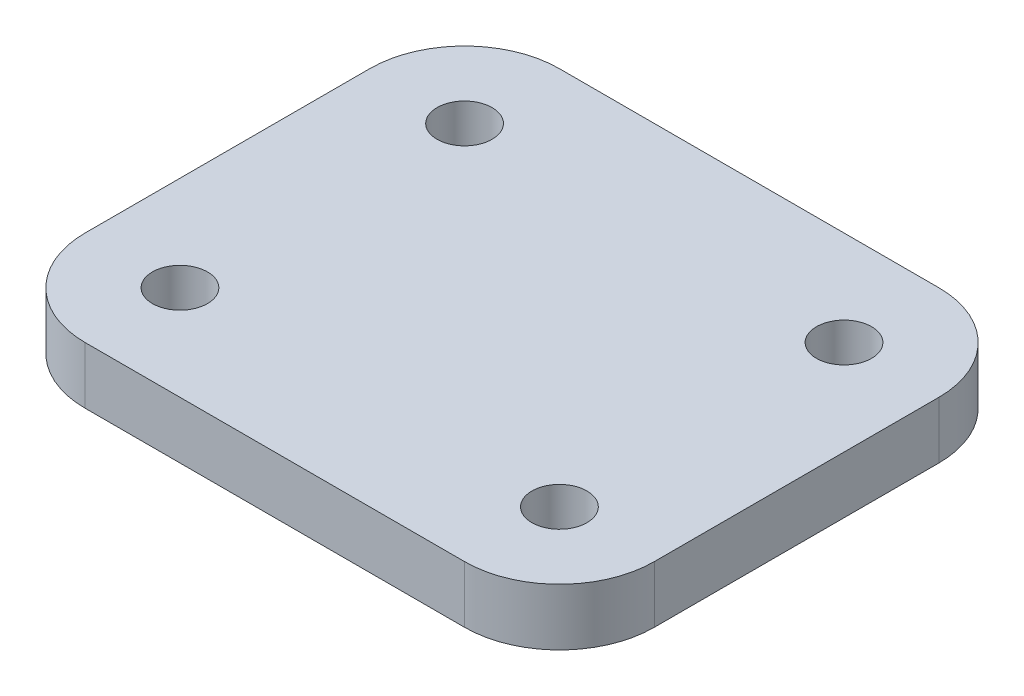
ISO-10303-21;
HEADER;
FILE_DESCRIPTION(('STEP AP214'),'2;1');
FILE_NAME('part.step','',(''),(''),'','','');
FILE_SCHEMA(('AUTOMOTIVE_DESIGN { 1 0 10303 214 1 1 1 1 }'));
ENDSEC;
DATA;
#1=APPLICATION_CONTEXT('core data for automotive mechanical design processes');
#2=APPLICATION_PROTOCOL_DEFINITION('international standard','automotive_design',2000,#1);
#3=PRODUCT_CONTEXT('',#1,'mechanical');
#4=PRODUCT('Part','Part','',(#3));
#5=PRODUCT_RELATED_PRODUCT_CATEGORY('part','',(#4));
#6=PRODUCT_DEFINITION_FORMATION('','',#4);
#7=PRODUCT_DEFINITION_CONTEXT('part definition',#1,'design');
#8=PRODUCT_DEFINITION('design','',#6,#7);
#9=PRODUCT_DEFINITION_SHAPE('','',#8);
#10=(LENGTH_UNIT() NAMED_UNIT(*) SI_UNIT(.MILLI.,.METRE.));
#11=(NAMED_UNIT(*) PLANE_ANGLE_UNIT() SI_UNIT($,.RADIAN.));
#12=(NAMED_UNIT(*) SI_UNIT($,.STERADIAN.) SOLID_ANGLE_UNIT());
#13=UNCERTAINTY_MEASURE_WITH_UNIT(LENGTH_MEASURE(1.E-05),#10,'distance_accuracy_value','');
#14=(GEOMETRIC_REPRESENTATION_CONTEXT(3) GLOBAL_UNCERTAINTY_ASSIGNED_CONTEXT((#13)) GLOBAL_UNIT_ASSIGNED_CONTEXT((#10,
#11,#12)) REPRESENTATION_CONTEXT('',''));
#15=CARTESIAN_POINT('',(0.,0.,0.));
#16=DIRECTION('',(0.,0.,1.));
#17=DIRECTION('',(1.,0.,0.));
#18=AXIS2_PLACEMENT_3D('',#15,#16,#17);
#19=CARTESIAN_POINT('',(0.,3.,0.));
#20=DIRECTION('',(0.,-1.,0.));
#21=DIRECTION('',(0.,0.,-1.));
#22=AXIS2_PLACEMENT_3D('',#19,#20,#21);
#23=PLANE('',#22);
#24=DIRECTION('',(0.,0.,1.));
#25=VECTOR('',#24,1.);
#26=CARTESIAN_POINT('',(-15.,3.,12.5));
#27=LINE('',#26,#25);
#28=CARTESIAN_POINT('',(-15.,3.,-7.5));
#29=VERTEX_POINT('',#28);
#30=CARTESIAN_POINT('',(-15.,3.,7.5));
#31=VERTEX_POINT('',#30);
#32=EDGE_CURVE('E205',#29,#31,#27,.T.);
#33=ORIENTED_EDGE('',*,*,#32,.T.);
#34=CARTESIAN_POINT('',(-9.99999999999999,3.,7.5));
#35=DIRECTION('',(0.,-1.,0.));
#36=DIRECTION('',(0.,0.,-1.));
#37=AXIS2_PLACEMENT_3D('',#34,#35,#36);
#38=CIRCLE('',#37,5.);
#39=CARTESIAN_POINT('',(-9.99999999999999,3.,12.5));
#40=VERTEX_POINT('',#39);
#41=EDGE_CURVE('E174',#31,#40,#38,.F.);
#42=ORIENTED_EDGE('',*,*,#41,.T.);
#43=DIRECTION('',(1.,0.,0.));
#44=VECTOR('',#43,1.);
#45=CARTESIAN_POINT('',(-15.,3.,12.5));
#46=LINE('',#45,#44);
#47=CARTESIAN_POINT('',(9.99999999999999,3.,12.5));
#48=VERTEX_POINT('',#47);
#49=EDGE_CURVE('E132',#40,#48,#46,.T.);
#50=ORIENTED_EDGE('',*,*,#49,.T.);
#51=CARTESIAN_POINT('',(10.,3.,7.5));
#52=DIRECTION('',(0.,-1.,0.));
#53=DIRECTION('',(0.,0.,-1.));
#54=AXIS2_PLACEMENT_3D('',#51,#52,#53);
#55=CIRCLE('',#54,5.);
#56=CARTESIAN_POINT('',(15.,3.,7.5));
#57=VERTEX_POINT('',#56);
#58=EDGE_CURVE('E166',#48,#57,#55,.F.);
#59=ORIENTED_EDGE('',*,*,#58,.T.);
#60=DIRECTION('',(0.,0.,-1.));
#61=VECTOR('',#60,1.);
#62=CARTESIAN_POINT('',(15.,3.,12.5));
#63=LINE('',#62,#61);
#64=CARTESIAN_POINT('',(15.,3.,-7.5));
#65=VERTEX_POINT('',#64);
#66=EDGE_CURVE('E141',#57,#65,#63,.T.);
#67=ORIENTED_EDGE('',*,*,#66,.T.);
#68=CARTESIAN_POINT('',(10.,3.,-7.5));
#69=DIRECTION('',(0.,-1.,0.));
#70=DIRECTION('',(0.,0.,-1.));
#71=AXIS2_PLACEMENT_3D('',#68,#69,#70);
#72=CIRCLE('',#71,5.);
#73=CARTESIAN_POINT('',(9.99999999999999,3.,-12.5));
#74=VERTEX_POINT('',#73);
#75=EDGE_CURVE('E67',#65,#74,#72,.F.);
#76=ORIENTED_EDGE('',*,*,#75,.T.);
#77=DIRECTION('',(-1.,0.,0.));
#78=VECTOR('',#77,1.);
#79=CARTESIAN_POINT('',(-15.,3.,-12.5));
#80=LINE('',#79,#78);
#81=CARTESIAN_POINT('',(-9.99999999999999,3.,-12.5));
#82=VERTEX_POINT('',#81);
#83=EDGE_CURVE('E146',#74,#82,#80,.T.);
#84=ORIENTED_EDGE('',*,*,#83,.T.);
#85=CARTESIAN_POINT('',(-9.99999999999999,3.,-7.5));
#86=DIRECTION('',(0.,-1.,0.));
#87=DIRECTION('',(0.,0.,-1.));
#88=AXIS2_PLACEMENT_3D('',#85,#86,#87);
#89=CIRCLE('',#88,5.);
#90=EDGE_CURVE('E171',#82,#29,#89,.F.);
#91=ORIENTED_EDGE('',*,*,#90,.T.);
#92=EDGE_LOOP('',(#33,#42,#50,#59,#67,#76,#84,#91));
#93=FACE_BOUND('',#92,.T.);
#94=CARTESIAN_POINT('',(-10.,3.,-7.5));
#95=DIRECTION('',(0.,1.,0.));
#96=DIRECTION('',(0.,0.,1.));
#97=AXIS2_PLACEMENT_3D('',#94,#95,#96);
#98=CIRCLE('',#97,1.45);
#99=CARTESIAN_POINT('',(-10.,3.,-6.05));
#100=VERTEX_POINT('',#99);
#101=EDGE_CURVE('E195',#100,#100,#98,.T.);
#102=ORIENTED_EDGE('',*,*,#101,.F.);
#103=EDGE_LOOP('',(#102));
#104=FACE_BOUND('',#103,.T.);
#105=CARTESIAN_POINT('',(-10.,3.,7.5));
#106=DIRECTION('',(0.,1.,0.));
#107=DIRECTION('',(0.,0.,1.));
#108=AXIS2_PLACEMENT_3D('',#105,#106,#107);
#109=CIRCLE('',#108,1.45);
#110=CARTESIAN_POINT('',(-10.,3.,8.95));
#111=VERTEX_POINT('',#110);
#112=EDGE_CURVE('E213',#111,#111,#109,.T.);
#113=ORIENTED_EDGE('',*,*,#112,.F.);
#114=EDGE_LOOP('',(#113));
#115=FACE_BOUND('',#114,.T.);
#116=CARTESIAN_POINT('',(9.99999999999999,3.,7.5));
#117=DIRECTION('',(0.,1.,0.));
#118=DIRECTION('',(0.,0.,1.));
#119=AXIS2_PLACEMENT_3D('',#116,#117,#118);
#120=CIRCLE('',#119,1.45);
#121=CARTESIAN_POINT('',(9.99999999999999,3.,8.95));
#122=VERTEX_POINT('',#121);
#123=EDGE_CURVE('E219',#122,#122,#120,.T.);
#124=ORIENTED_EDGE('',*,*,#123,.F.);
#125=EDGE_LOOP('',(#124));
#126=FACE_BOUND('',#125,.T.);
#127=CARTESIAN_POINT('',(9.99999999999999,3.,-7.5));
#128=DIRECTION('',(0.,1.,0.));
#129=DIRECTION('',(0.,0.,1.));
#130=AXIS2_PLACEMENT_3D('',#127,#128,#129);
#131=CIRCLE('',#130,1.45);
#132=CARTESIAN_POINT('',(9.99999999999999,3.,-6.05));
#133=VERTEX_POINT('',#132);
#134=EDGE_CURVE('E227',#133,#133,#131,.T.);
#135=ORIENTED_EDGE('',*,*,#134,.F.);
#136=EDGE_LOOP('',(#135));
#137=FACE_BOUND('',#136,.T.);
#138=ADVANCED_FACE('F44',(#93,#104,#115,#126,#137),#23,.F.);
#139=CARTESIAN_POINT('',(0.,0.,0.));
#140=DIRECTION('',(0.,-1.,0.));
#141=DIRECTION('',(0.,0.,-1.));
#142=AXIS2_PLACEMENT_3D('',#139,#140,#141);
#143=PLANE('',#142);
#144=CARTESIAN_POINT('',(9.99999999999999,0.,7.5));
#145=DIRECTION('',(0.,1.,0.));
#146=DIRECTION('',(0.,0.,1.));
#147=AXIS2_PLACEMENT_3D('',#144,#145,#146);
#148=CIRCLE('',#147,1.45);
#149=CARTESIAN_POINT('',(9.99999999999999,0.,8.95));
#150=VERTEX_POINT('',#149);
#151=EDGE_CURVE('E223',#150,#150,#148,.T.);
#152=ORIENTED_EDGE('',*,*,#151,.T.);
#153=EDGE_LOOP('',(#152));
#154=FACE_BOUND('',#153,.T.);
#155=CARTESIAN_POINT('',(-10.,0.,-7.5));
#156=DIRECTION('',(0.,1.,0.));
#157=DIRECTION('',(0.,0.,1.));
#158=AXIS2_PLACEMENT_3D('',#155,#156,#157);
#159=CIRCLE('',#158,1.45);
#160=CARTESIAN_POINT('',(-10.,0.,-6.05));
#161=VERTEX_POINT('',#160);
#162=EDGE_CURVE('E200',#161,#161,#159,.T.);
#163=ORIENTED_EDGE('',*,*,#162,.T.);
#164=EDGE_LOOP('',(#163));
#165=FACE_BOUND('',#164,.T.);
#166=DIRECTION('',(1.,0.,0.));
#167=VECTOR('',#166,1.);
#168=CARTESIAN_POINT('',(-15.,0.,12.5));
#169=LINE('',#168,#167);
#170=CARTESIAN_POINT('',(-9.99999999999999,0.,12.5));
#171=VERTEX_POINT('',#170);
#172=CARTESIAN_POINT('',(9.99999999999999,0.,12.5));
#173=VERTEX_POINT('',#172);
#174=EDGE_CURVE('E129',#171,#173,#169,.T.);
#175=ORIENTED_EDGE('',*,*,#174,.F.);
#176=CARTESIAN_POINT('',(-9.99999999999999,0.,7.5));
#177=DIRECTION('',(0.,-1.,0.));
#178=DIRECTION('',(0.,0.,-1.));
#179=AXIS2_PLACEMENT_3D('',#176,#177,#178);
#180=CIRCLE('',#179,5.);
#181=CARTESIAN_POINT('',(-15.,0.,7.5));
#182=VERTEX_POINT('',#181);
#183=EDGE_CURVE('E111',#171,#182,#180,.T.);
#184=ORIENTED_EDGE('',*,*,#183,.T.);
#185=DIRECTION('',(0.,0.,1.));
#186=VECTOR('',#185,1.);
#187=CARTESIAN_POINT('',(-15.,0.,12.5));
#188=LINE('',#187,#186);
#189=CARTESIAN_POINT('',(-15.,0.,-7.5));
#190=VERTEX_POINT('',#189);
#191=EDGE_CURVE('E142',#190,#182,#188,.T.);
#192=ORIENTED_EDGE('',*,*,#191,.F.);
#193=CARTESIAN_POINT('',(-9.99999999999999,0.,-7.5));
#194=DIRECTION('',(0.,-1.,0.));
#195=DIRECTION('',(0.,0.,-1.));
#196=AXIS2_PLACEMENT_3D('',#193,#194,#195);
#197=CIRCLE('',#196,5.);
#198=CARTESIAN_POINT('',(-9.99999999999999,0.,-12.5));
#199=VERTEX_POINT('',#198);
#200=EDGE_CURVE('E123',#190,#199,#197,.T.);
#201=ORIENTED_EDGE('',*,*,#200,.T.);
#202=DIRECTION('',(-1.,0.,0.));
#203=VECTOR('',#202,1.);
#204=CARTESIAN_POINT('',(-15.,0.,-12.5));
#205=LINE('',#204,#203);
#206=CARTESIAN_POINT('',(9.99999999999999,0.,-12.5));
#207=VERTEX_POINT('',#206);
#208=EDGE_CURVE('E148',#207,#199,#205,.T.);
#209=ORIENTED_EDGE('',*,*,#208,.F.);
#210=CARTESIAN_POINT('',(10.,0.,-7.5));
#211=DIRECTION('',(0.,-1.,0.));
#212=DIRECTION('',(0.,0.,-1.));
#213=AXIS2_PLACEMENT_3D('',#210,#211,#212);
#214=CIRCLE('',#213,5.);
#215=CARTESIAN_POINT('',(15.,0.,-7.5));
#216=VERTEX_POINT('',#215);
#217=EDGE_CURVE('E156',#207,#216,#214,.T.);
#218=ORIENTED_EDGE('',*,*,#217,.T.);
#219=DIRECTION('',(0.,0.,-1.));
#220=VECTOR('',#219,1.);
#221=CARTESIAN_POINT('',(15.,0.,12.5));
#222=LINE('',#221,#220);
#223=CARTESIAN_POINT('',(15.,0.,7.5));
#224=VERTEX_POINT('',#223);
#225=EDGE_CURVE('E189',#224,#216,#222,.T.);
#226=ORIENTED_EDGE('',*,*,#225,.F.);
#227=CARTESIAN_POINT('',(10.,0.,7.5));
#228=DIRECTION('',(0.,-1.,0.));
#229=DIRECTION('',(0.,0.,-1.));
#230=AXIS2_PLACEMENT_3D('',#227,#228,#229);
#231=CIRCLE('',#230,5.);
#232=EDGE_CURVE('E134',#224,#173,#231,.T.);
#233=ORIENTED_EDGE('',*,*,#232,.T.);
#234=EDGE_LOOP('',(#175,#184,#192,#201,#209,#218,#226,#233));
#235=FACE_BOUND('',#234,.T.);
#236=CARTESIAN_POINT('',(-10.,0.,7.5));
#237=DIRECTION('',(0.,1.,0.));
#238=DIRECTION('',(0.,0.,1.));
#239=AXIS2_PLACEMENT_3D('',#236,#237,#238);
#240=CIRCLE('',#239,1.45);
#241=CARTESIAN_POINT('',(-10.,0.,8.95));
#242=VERTEX_POINT('',#241);
#243=EDGE_CURVE('E215',#242,#242,#240,.T.);
#244=ORIENTED_EDGE('',*,*,#243,.T.);
#245=EDGE_LOOP('',(#244));
#246=FACE_BOUND('',#245,.T.);
#247=CARTESIAN_POINT('',(9.99999999999999,0.,-7.5));
#248=DIRECTION('',(0.,1.,0.));
#249=DIRECTION('',(0.,0.,1.));
#250=AXIS2_PLACEMENT_3D('',#247,#248,#249);
#251=CIRCLE('',#250,1.45);
#252=CARTESIAN_POINT('',(9.99999999999999,0.,-6.05));
#253=VERTEX_POINT('',#252);
#254=EDGE_CURVE('E231',#253,#253,#251,.T.);
#255=ORIENTED_EDGE('',*,*,#254,.T.);
#256=EDGE_LOOP('',(#255));
#257=FACE_BOUND('',#256,.T.);
#258=ADVANCED_FACE('F137',(#154,#165,#235,#246,#257),#143,.T.);
#259=CARTESIAN_POINT('',(15.,3.,12.5));
#260=DIRECTION('',(-1.,0.,0.));
#261=DIRECTION('',(0.,0.,1.));
#262=AXIS2_PLACEMENT_3D('',#259,#260,#261);
#263=PLANE('',#262);
#264=ORIENTED_EDGE('',*,*,#225,.T.);
#265=DIRECTION('',(0.,-1.,0.));
#266=VECTOR('',#265,1.);
#267=CARTESIAN_POINT('',(15.,3.,-7.5));
#268=LINE('',#267,#266);
#269=EDGE_CURVE('E11',#216,#65,#268,.F.);
#270=ORIENTED_EDGE('',*,*,#269,.T.);
#271=ORIENTED_EDGE('',*,*,#66,.F.);
#272=DIRECTION('',(0.,-1.,0.));
#273=VECTOR('',#272,1.);
#274=CARTESIAN_POINT('',(15.,3.,7.5));
#275=LINE('',#274,#273);
#276=EDGE_CURVE('E53',#57,#224,#275,.T.);
#277=ORIENTED_EDGE('',*,*,#276,.T.);
#278=EDGE_LOOP('',(#264,#270,#271,#277));
#279=FACE_BOUND('',#278,.T.);
#280=ADVANCED_FACE('F188',(#279),#263,.F.);
#281=CARTESIAN_POINT('',(-15.,3.,-12.5));
#282=DIRECTION('',(0.,0.,1.));
#283=DIRECTION('',(1.,0.,0.));
#284=AXIS2_PLACEMENT_3D('',#281,#282,#283);
#285=PLANE('',#284);
#286=ORIENTED_EDGE('',*,*,#208,.T.);
#287=DIRECTION('',(0.,-1.,0.));
#288=VECTOR('',#287,1.);
#289=CARTESIAN_POINT('',(-9.99999999999999,3.,-12.5));
#290=LINE('',#289,#288);
#291=EDGE_CURVE('E60',#199,#82,#290,.F.);
#292=ORIENTED_EDGE('',*,*,#291,.T.);
#293=ORIENTED_EDGE('',*,*,#83,.F.);
#294=DIRECTION('',(0.,-1.,0.));
#295=VECTOR('',#294,1.);
#296=CARTESIAN_POINT('',(10.,3.,-12.5));
#297=LINE('',#296,#295);
#298=EDGE_CURVE('E177',#74,#207,#297,.T.);
#299=ORIENTED_EDGE('',*,*,#298,.T.);
#300=EDGE_LOOP('',(#286,#292,#293,#299));
#301=FACE_BOUND('',#300,.T.);
#302=ADVANCED_FACE('F260',(#301),#285,.F.);
#303=CARTESIAN_POINT('',(-15.,3.,12.5));
#304=DIRECTION('',(1.,0.,0.));
#305=DIRECTION('',(0.,0.,-1.));
#306=AXIS2_PLACEMENT_3D('',#303,#304,#305);
#307=PLANE('',#306);
#308=ORIENTED_EDGE('',*,*,#191,.T.);
#309=DIRECTION('',(0.,-1.,0.));
#310=VECTOR('',#309,1.);
#311=CARTESIAN_POINT('',(-15.,3.,7.5));
#312=LINE('',#311,#310);
#313=EDGE_CURVE('E116',#182,#31,#312,.F.);
#314=ORIENTED_EDGE('',*,*,#313,.T.);
#315=ORIENTED_EDGE('',*,*,#32,.F.);
#316=DIRECTION('',(0.,-1.,0.));
#317=VECTOR('',#316,1.);
#318=CARTESIAN_POINT('',(-15.,3.,-7.5));
#319=LINE('',#318,#317);
#320=EDGE_CURVE('E122',#29,#190,#319,.T.);
#321=ORIENTED_EDGE('',*,*,#320,.T.);
#322=EDGE_LOOP('',(#308,#314,#315,#321));
#323=FACE_BOUND('',#322,.T.);
#324=ADVANCED_FACE('F257',(#323),#307,.F.);
#325=CARTESIAN_POINT('',(-15.,3.,12.5));
#326=DIRECTION('',(0.,0.,-1.));
#327=DIRECTION('',(-1.,0.,0.));
#328=AXIS2_PLACEMENT_3D('',#325,#326,#327);
#329=PLANE('',#328);
#330=ORIENTED_EDGE('',*,*,#49,.F.);
#331=DIRECTION('',(0.,-1.,0.));
#332=VECTOR('',#331,1.);
#333=CARTESIAN_POINT('',(-9.99999999999999,3.,12.5));
#334=LINE('',#333,#332);
#335=EDGE_CURVE('E115',#40,#171,#334,.T.);
#336=ORIENTED_EDGE('',*,*,#335,.T.);
#337=ORIENTED_EDGE('',*,*,#174,.T.);
#338=DIRECTION('',(0.,-1.,0.));
#339=VECTOR('',#338,1.);
#340=CARTESIAN_POINT('',(10.,3.,12.5));
#341=LINE('',#340,#339);
#342=EDGE_CURVE('E135',#173,#48,#341,.F.);
#343=ORIENTED_EDGE('',*,*,#342,.T.);
#344=EDGE_LOOP('',(#330,#336,#337,#343));
#345=FACE_BOUND('',#344,.T.);
#346=ADVANCED_FACE('F128',(#345),#329,.F.);
#347=CARTESIAN_POINT('',(-10.,3.,-7.5));
#348=DIRECTION('',(0.,-1.,0.));
#349=DIRECTION('',(0.,0.,-1.));
#350=AXIS2_PLACEMENT_3D('',#347,#348,#349);
#351=CYLINDRICAL_SURFACE('',#350,1.45);
#352=ORIENTED_EDGE('',*,*,#101,.T.);
#353=EDGE_LOOP('',(#352));
#354=FACE_BOUND('',#353,.T.);
#355=ORIENTED_EDGE('',*,*,#162,.F.);
#356=EDGE_LOOP('',(#355));
#357=FACE_BOUND('',#356,.T.);
#358=ADVANCED_FACE('F252',(#354,#357),#351,.F.);
#359=CARTESIAN_POINT('',(-10.,3.,7.5));
#360=DIRECTION('',(0.,-1.,0.));
#361=DIRECTION('',(0.,0.,-1.));
#362=AXIS2_PLACEMENT_3D('',#359,#360,#361);
#363=CYLINDRICAL_SURFACE('',#362,1.45);
#364=ORIENTED_EDGE('',*,*,#112,.T.);
#365=EDGE_LOOP('',(#364));
#366=FACE_BOUND('',#365,.T.);
#367=ORIENTED_EDGE('',*,*,#243,.F.);
#368=EDGE_LOOP('',(#367));
#369=FACE_BOUND('',#368,.T.);
#370=ADVANCED_FACE('F317',(#366,#369),#363,.F.);
#371=CARTESIAN_POINT('',(9.99999999999999,3.,7.5));
#372=DIRECTION('',(0.,-1.,0.));
#373=DIRECTION('',(0.,0.,-1.));
#374=AXIS2_PLACEMENT_3D('',#371,#372,#373);
#375=CYLINDRICAL_SURFACE('',#374,1.45);
#376=ORIENTED_EDGE('',*,*,#123,.T.);
#377=EDGE_LOOP('',(#376));
#378=FACE_BOUND('',#377,.T.);
#379=ORIENTED_EDGE('',*,*,#151,.F.);
#380=EDGE_LOOP('',(#379));
#381=FACE_BOUND('',#380,.T.);
#382=ADVANCED_FACE('F308',(#378,#381),#375,.F.);
#383=CARTESIAN_POINT('',(9.99999999999999,3.,-7.5));
#384=DIRECTION('',(0.,-1.,0.));
#385=DIRECTION('',(0.,0.,-1.));
#386=AXIS2_PLACEMENT_3D('',#383,#384,#385);
#387=CYLINDRICAL_SURFACE('',#386,1.45);
#388=ORIENTED_EDGE('',*,*,#134,.T.);
#389=EDGE_LOOP('',(#388));
#390=FACE_BOUND('',#389,.T.);
#391=ORIENTED_EDGE('',*,*,#254,.F.);
#392=EDGE_LOOP('',(#391));
#393=FACE_BOUND('',#392,.T.);
#394=ADVANCED_FACE('F239',(#390,#393),#387,.F.);
#395=CARTESIAN_POINT('',(-9.99999999999999,3.,7.5));
#396=DIRECTION('',(0.,-1.,0.));
#397=DIRECTION('',(0.,0.,-1.));
#398=AXIS2_PLACEMENT_3D('',#395,#396,#397);
#399=CYLINDRICAL_SURFACE('',#398,5.);
#400=ORIENTED_EDGE('',*,*,#41,.F.);
#401=ORIENTED_EDGE('',*,*,#313,.F.);
#402=ORIENTED_EDGE('',*,*,#183,.F.);
#403=ORIENTED_EDGE('',*,*,#335,.F.);
#404=EDGE_LOOP('',(#400,#401,#402,#403));
#405=FACE_BOUND('',#404,.T.);
#406=ADVANCED_FACE('F114',(#405),#399,.T.);
#407=CARTESIAN_POINT('',(-9.99999999999999,3.,-7.5));
#408=DIRECTION('',(0.,-1.,0.));
#409=DIRECTION('',(0.,0.,-1.));
#410=AXIS2_PLACEMENT_3D('',#407,#408,#409);
#411=CYLINDRICAL_SURFACE('',#410,5.);
#412=ORIENTED_EDGE('',*,*,#90,.F.);
#413=ORIENTED_EDGE('',*,*,#291,.F.);
#414=ORIENTED_EDGE('',*,*,#200,.F.);
#415=ORIENTED_EDGE('',*,*,#320,.F.);
#416=EDGE_LOOP('',(#412,#413,#414,#415));
#417=FACE_BOUND('',#416,.T.);
#418=ADVANCED_FACE('F268',(#417),#411,.T.);
#419=CARTESIAN_POINT('',(10.,3.,-7.5));
#420=DIRECTION('',(0.,-1.,0.));
#421=DIRECTION('',(0.,0.,-1.));
#422=AXIS2_PLACEMENT_3D('',#419,#420,#421);
#423=CYLINDRICAL_SURFACE('',#422,5.);
#424=ORIENTED_EDGE('',*,*,#75,.F.);
#425=ORIENTED_EDGE('',*,*,#269,.F.);
#426=ORIENTED_EDGE('',*,*,#217,.F.);
#427=ORIENTED_EDGE('',*,*,#298,.F.);
#428=EDGE_LOOP('',(#424,#425,#426,#427));
#429=FACE_BOUND('',#428,.T.);
#430=ADVANCED_FACE('F270',(#429),#423,.T.);
#431=CARTESIAN_POINT('',(10.,3.,7.5));
#432=DIRECTION('',(0.,-1.,0.));
#433=DIRECTION('',(0.,0.,-1.));
#434=AXIS2_PLACEMENT_3D('',#431,#432,#433);
#435=CYLINDRICAL_SURFACE('',#434,5.);
#436=ORIENTED_EDGE('',*,*,#58,.F.);
#437=ORIENTED_EDGE('',*,*,#342,.F.);
#438=ORIENTED_EDGE('',*,*,#232,.F.);
#439=ORIENTED_EDGE('',*,*,#276,.F.);
#440=EDGE_LOOP('',(#436,#437,#438,#439));
#441=FACE_BOUND('',#440,.T.);
#442=ADVANCED_FACE('F46',(#441),#435,.T.);
#443=CLOSED_SHELL('',(#138,#258,#280,#302,#324,#346,#358,#370,#382,#394,#406,#418,#430,#442));
#444=MANIFOLD_SOLID_BREP('B2',#443);
#445=ADVANCED_BREP_SHAPE_REPRESENTATION('',(#18,#444),#14);
#446=SHAPE_DEFINITION_REPRESENTATION(#9,#445);
ENDSEC;
END-ISO-10303-21;
